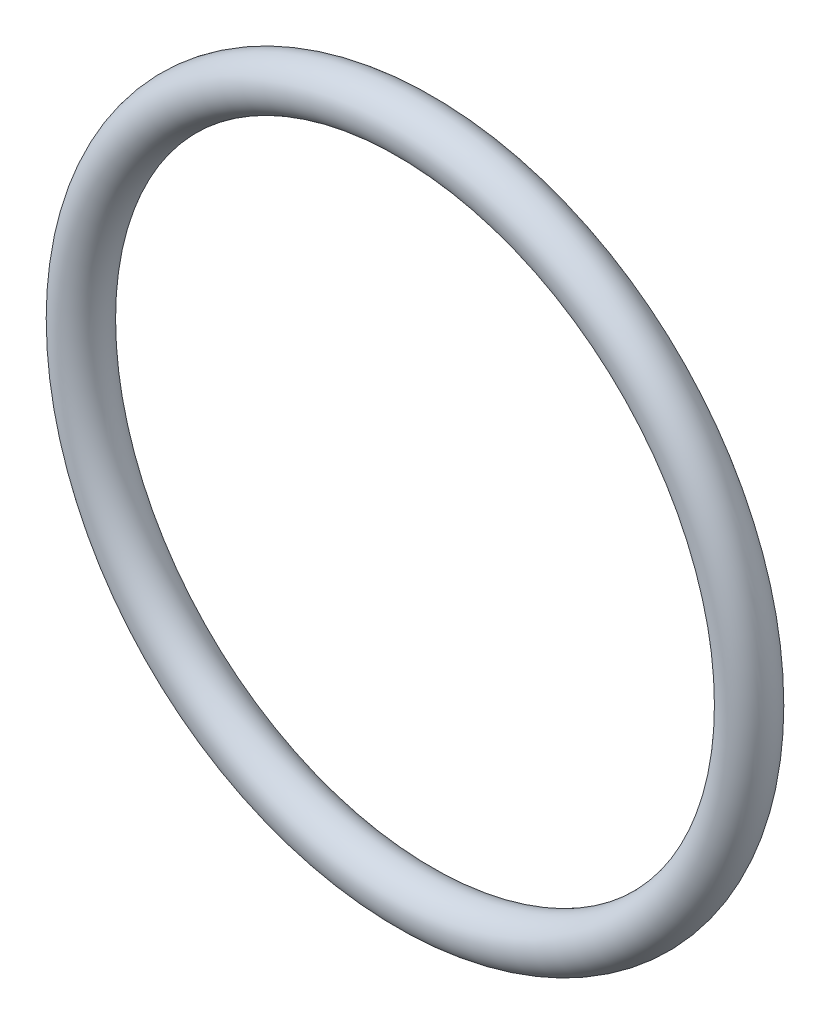
ISO-10303-21;
HEADER;
FILE_DESCRIPTION(('STEP AP214'),'2;1');
FILE_NAME('part.step','',(''),(''),'','','');
FILE_SCHEMA(('AUTOMOTIVE_DESIGN { 1 0 10303 214 1 1 1 1 }'));
ENDSEC;
DATA;
#1=APPLICATION_CONTEXT('core data for automotive mechanical design processes');
#2=APPLICATION_PROTOCOL_DEFINITION('international standard','automotive_design',2000,#1);
#3=PRODUCT_CONTEXT('',#1,'mechanical');
#4=PRODUCT('Part','Part','',(#3));
#5=PRODUCT_RELATED_PRODUCT_CATEGORY('part','',(#4));
#6=PRODUCT_DEFINITION_FORMATION('','',#4);
#7=PRODUCT_DEFINITION_CONTEXT('part definition',#1,'design');
#8=PRODUCT_DEFINITION('design','',#6,#7);
#9=PRODUCT_DEFINITION_SHAPE('','',#8);
#10=(LENGTH_UNIT() NAMED_UNIT(*) SI_UNIT(.MILLI.,.METRE.));
#11=(NAMED_UNIT(*) PLANE_ANGLE_UNIT() SI_UNIT($,.RADIAN.));
#12=(NAMED_UNIT(*) SI_UNIT($,.STERADIAN.) SOLID_ANGLE_UNIT());
#13=UNCERTAINTY_MEASURE_WITH_UNIT(LENGTH_MEASURE(1.E-05),#10,'distance_accuracy_value','');
#14=(GEOMETRIC_REPRESENTATION_CONTEXT(3) GLOBAL_UNCERTAINTY_ASSIGNED_CONTEXT((#13)) GLOBAL_UNIT_ASSIGNED_CONTEXT((#10,
#11,#12)) REPRESENTATION_CONTEXT('',''));
#15=CARTESIAN_POINT('',(0.,0.,0.));
#16=DIRECTION('',(0.,0.,1.));
#17=DIRECTION('',(1.,0.,0.));
#18=AXIS2_PLACEMENT_3D('',#15,#16,#17);
#19=CARTESIAN_POINT('',(0.,0.,0.));
#20=DIRECTION('',(0.,0.,1.));
#21=DIRECTION('',(1.,0.,0.));
#22=AXIS2_PLACEMENT_3D('',#19,#20,#21);
#23=TOROIDAL_SURFACE('',#22,17.8054,1.3081);
#24=CARTESIAN_POINT('',(19.1135,0.,0.));
#25=VERTEX_POINT('',#24);
#26=VERTEX_LOOP('',#25);
#27=FACE_BOUND('',#26,.T.);
#28=ADVANCED_FACE('F30',(#27),#23,.T.);
#29=CLOSED_SHELL('',(#28));
#30=MANIFOLD_SOLID_BREP('B2',#29);
#31=ADVANCED_BREP_SHAPE_REPRESENTATION('',(#18,#30),#14);
#32=SHAPE_DEFINITION_REPRESENTATION(#9,#31);
ENDSEC;
END-ISO-10303-21;
